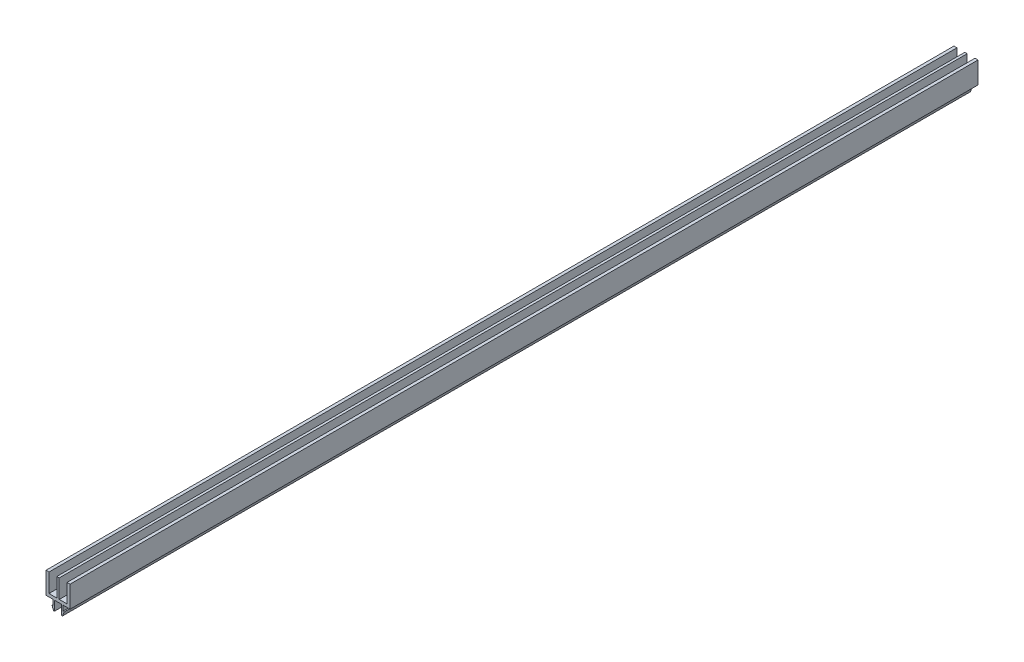
ISO-10303-21;
HEADER;
FILE_DESCRIPTION(('STEP AP214'),'2;1');
FILE_NAME('part.step','',(''),(''),'','','');
FILE_SCHEMA(('AUTOMOTIVE_DESIGN { 1 0 10303 214 1 1 1 1 }'));
ENDSEC;
DATA;
#1=APPLICATION_CONTEXT('core data for automotive mechanical design processes');
#2=APPLICATION_PROTOCOL_DEFINITION('international standard','automotive_design',2000,#1);
#3=PRODUCT_CONTEXT('',#1,'mechanical');
#4=PRODUCT('Part','Part','',(#3));
#5=PRODUCT_RELATED_PRODUCT_CATEGORY('part','',(#4));
#6=PRODUCT_DEFINITION_FORMATION('','',#4);
#7=PRODUCT_DEFINITION_CONTEXT('part definition',#1,'design');
#8=PRODUCT_DEFINITION('design','',#6,#7);
#9=PRODUCT_DEFINITION_SHAPE('','',#8);
#10=(LENGTH_UNIT() NAMED_UNIT(*) SI_UNIT(.MILLI.,.METRE.));
#11=(NAMED_UNIT(*) PLANE_ANGLE_UNIT() SI_UNIT($,.RADIAN.));
#12=(NAMED_UNIT(*) SI_UNIT($,.STERADIAN.) SOLID_ANGLE_UNIT());
#13=UNCERTAINTY_MEASURE_WITH_UNIT(LENGTH_MEASURE(1.E-05),#10,'distance_accuracy_value','');
#14=(GEOMETRIC_REPRESENTATION_CONTEXT(3) GLOBAL_UNCERTAINTY_ASSIGNED_CONTEXT((#13)) GLOBAL_UNIT_ASSIGNED_CONTEXT((#10,
#11,#12)) REPRESENTATION_CONTEXT('',''));
#15=CARTESIAN_POINT('',(0.,0.,0.));
#16=DIRECTION('',(0.,0.,1.));
#17=DIRECTION('',(1.,0.,0.));
#18=AXIS2_PLACEMENT_3D('',#15,#16,#17);
#19=CARTESIAN_POINT('',(-1.,17.9999999975,-704.));
#20=DIRECTION('',(-1.,0.,0.));
#21=DIRECTION('',(0.,-1.,0.));
#22=AXIS2_PLACEMENT_3D('',#19,#20,#21);
#23=PLANE('',#22);
#24=DIRECTION('',(0.,-1.,0.));
#25=VECTOR('',#24,1.);
#26=CARTESIAN_POINT('',(-1.,17.9999999975,50.));
#27=LINE('',#26,#25);
#28=CARTESIAN_POINT('',(-1.,17.9999999975,50.));
#29=VERTEX_POINT('',#28);
#30=CARTESIAN_POINT('',(-1.,2.4999999995,50.));
#31=VERTEX_POINT('',#30);
#32=EDGE_CURVE('E226',#29,#31,#27,.T.);
#33=ORIENTED_EDGE('',*,*,#32,.F.);
#34=DIRECTION('',(0.,0.,1.));
#35=VECTOR('',#34,1.);
#36=CARTESIAN_POINT('',(-1.,17.9999999975,-704.));
#37=LINE('',#36,#35);
#38=CARTESIAN_POINT('',(-1.,17.9999999975,-704.));
#39=VERTEX_POINT('',#38);
#40=EDGE_CURVE('E11',#39,#29,#37,.T.);
#41=ORIENTED_EDGE('',*,*,#40,.F.);
#42=DIRECTION('',(0.,-1.,0.));
#43=VECTOR('',#42,1.);
#44=CARTESIAN_POINT('',(-1.,17.9999999975,-704.));
#45=LINE('',#44,#43);
#46=CARTESIAN_POINT('',(-1.,2.4999999995,-704.));
#47=VERTEX_POINT('',#46);
#48=EDGE_CURVE('E294',#39,#47,#45,.T.);
#49=ORIENTED_EDGE('',*,*,#48,.T.);
#50=DIRECTION('',(0.,0.,1.));
#51=VECTOR('',#50,1.);
#52=CARTESIAN_POINT('',(-1.,2.4999999995,-704.));
#53=LINE('',#52,#51);
#54=EDGE_CURVE('E36',#47,#31,#53,.T.);
#55=ORIENTED_EDGE('',*,*,#54,.T.);
#56=EDGE_LOOP('',(#33,#41,#49,#55));
#57=FACE_BOUND('',#56,.T.);
#58=ADVANCED_FACE('F33',(#57),#23,.T.);
#59=CARTESIAN_POINT('',(0.999999999999998,17.9999999975,-704.));
#60=DIRECTION('',(0.,1.,0.));
#61=DIRECTION('',(0.,0.,1.));
#62=AXIS2_PLACEMENT_3D('',#59,#60,#61);
#63=PLANE('',#62);
#64=DIRECTION('',(-1.,0.,0.));
#65=VECTOR('',#64,1.);
#66=CARTESIAN_POINT('',(0.999999999999998,17.9999999975,50.));
#67=LINE('',#66,#65);
#68=CARTESIAN_POINT('',(0.999999999999998,17.9999999975,50.));
#69=VERTEX_POINT('',#68);
#70=EDGE_CURVE('E292',#69,#29,#67,.T.);
#71=ORIENTED_EDGE('',*,*,#70,.F.);
#72=DIRECTION('',(0.,0.,1.));
#73=VECTOR('',#72,1.);
#74=CARTESIAN_POINT('',(0.999999999999998,17.9999999975,-704.));
#75=LINE('',#74,#73);
#76=CARTESIAN_POINT('',(0.999999999999998,17.9999999975,-704.));
#77=VERTEX_POINT('',#76);
#78=EDGE_CURVE('E42',#77,#69,#75,.T.);
#79=ORIENTED_EDGE('',*,*,#78,.F.);
#80=DIRECTION('',(-1.,0.,0.));
#81=VECTOR('',#80,1.);
#82=CARTESIAN_POINT('',(0.999999999999998,17.9999999975,-704.));
#83=LINE('',#82,#81);
#84=EDGE_CURVE('E216',#77,#39,#83,.T.);
#85=ORIENTED_EDGE('',*,*,#84,.T.);
#86=ORIENTED_EDGE('',*,*,#40,.T.);
#87=EDGE_LOOP('',(#71,#79,#85,#86));
#88=FACE_BOUND('',#87,.T.);
#89=ADVANCED_FACE('F338',(#88),#63,.T.);
#90=CARTESIAN_POINT('',(0.999999999999998,2.4999999995,-704.));
#91=DIRECTION('',(1.,0.,0.));
#92=DIRECTION('',(0.,0.,-1.));
#93=AXIS2_PLACEMENT_3D('',#90,#91,#92);
#94=PLANE('',#93);
#95=DIRECTION('',(0.,1.,0.));
#96=VECTOR('',#95,1.);
#97=CARTESIAN_POINT('',(0.999999999999998,2.4999999995,50.));
#98=LINE('',#97,#96);
#99=CARTESIAN_POINT('',(0.999999999999998,2.4999999995,50.));
#100=VERTEX_POINT('',#99);
#101=EDGE_CURVE('E203',#100,#69,#98,.T.);
#102=ORIENTED_EDGE('',*,*,#101,.F.);
#103=DIRECTION('',(0.,0.,1.));
#104=VECTOR('',#103,1.);
#105=CARTESIAN_POINT('',(0.999999999999998,2.4999999995,-704.));
#106=LINE('',#105,#104);
#107=CARTESIAN_POINT('',(0.999999999999998,2.4999999995,-704.));
#108=VERTEX_POINT('',#107);
#109=EDGE_CURVE('E198',#108,#100,#106,.T.);
#110=ORIENTED_EDGE('',*,*,#109,.F.);
#111=DIRECTION('',(0.,1.,0.));
#112=VECTOR('',#111,1.);
#113=CARTESIAN_POINT('',(0.999999999999998,2.4999999995,-704.));
#114=LINE('',#113,#112);
#115=EDGE_CURVE('E201',#108,#77,#114,.T.);
#116=ORIENTED_EDGE('',*,*,#115,.T.);
#117=ORIENTED_EDGE('',*,*,#78,.T.);
#118=EDGE_LOOP('',(#102,#110,#116,#117));
#119=FACE_BOUND('',#118,.T.);
#120=ADVANCED_FACE('F200',(#119),#94,.T.);
#121=CARTESIAN_POINT('',(7.5,2.4999999995,-704.));
#122=DIRECTION('',(0.,1.,0.));
#123=DIRECTION('',(-1.,0.,0.));
#124=AXIS2_PLACEMENT_3D('',#121,#122,#123);
#125=PLANE('',#124);
#126=DIRECTION('',(-1.,0.,0.));
#127=VECTOR('',#126,1.);
#128=CARTESIAN_POINT('',(7.5,2.4999999995,50.));
#129=LINE('',#128,#127);
#130=CARTESIAN_POINT('',(7.5,2.4999999995,50.));
#131=VERTEX_POINT('',#130);
#132=EDGE_CURVE('E289',#131,#100,#129,.T.);
#133=ORIENTED_EDGE('',*,*,#132,.F.);
#134=DIRECTION('',(0.,0.,1.));
#135=VECTOR('',#134,1.);
#136=CARTESIAN_POINT('',(7.5,2.4999999995,-704.));
#137=LINE('',#136,#135);
#138=CARTESIAN_POINT('',(7.5,2.4999999995,-704.));
#139=VERTEX_POINT('',#138);
#140=EDGE_CURVE('E208',#139,#131,#137,.T.);
#141=ORIENTED_EDGE('',*,*,#140,.F.);
#142=DIRECTION('',(-1.,0.,0.));
#143=VECTOR('',#142,1.);
#144=CARTESIAN_POINT('',(7.5,2.4999999995,-704.));
#145=LINE('',#144,#143);
#146=EDGE_CURVE('E214',#139,#108,#145,.T.);
#147=ORIENTED_EDGE('',*,*,#146,.T.);
#148=ORIENTED_EDGE('',*,*,#109,.T.);
#149=EDGE_LOOP('',(#133,#141,#147,#148));
#150=FACE_BOUND('',#149,.T.);
#151=ADVANCED_FACE('F218',(#150),#125,.T.);
#152=CARTESIAN_POINT('',(7.5,17.9999999975,-704.));
#153=DIRECTION('',(-1.,0.,0.));
#154=DIRECTION('',(0.,-1.,0.));
#155=AXIS2_PLACEMENT_3D('',#152,#153,#154);
#156=PLANE('',#155);
#157=DIRECTION('',(0.,-1.,0.));
#158=VECTOR('',#157,1.);
#159=CARTESIAN_POINT('',(7.5,17.9999999975,50.));
#160=LINE('',#159,#158);
#161=CARTESIAN_POINT('',(7.5,17.9999999975,50.));
#162=VERTEX_POINT('',#161);
#163=EDGE_CURVE('E286',#162,#131,#160,.T.);
#164=ORIENTED_EDGE('',*,*,#163,.F.);
#165=DIRECTION('',(0.,0.,1.));
#166=VECTOR('',#165,1.);
#167=CARTESIAN_POINT('',(7.5,17.9999999975,-704.));
#168=LINE('',#167,#166);
#169=CARTESIAN_POINT('',(7.5,17.9999999975,-704.));
#170=VERTEX_POINT('',#169);
#171=EDGE_CURVE('E298',#170,#162,#168,.T.);
#172=ORIENTED_EDGE('',*,*,#171,.F.);
#173=DIRECTION('',(0.,-1.,0.));
#174=VECTOR('',#173,1.);
#175=CARTESIAN_POINT('',(7.5,17.9999999975,-704.));
#176=LINE('',#175,#174);
#177=EDGE_CURVE('E219',#170,#139,#176,.T.);
#178=ORIENTED_EDGE('',*,*,#177,.T.);
#179=ORIENTED_EDGE('',*,*,#140,.T.);
#180=EDGE_LOOP('',(#164,#172,#178,#179));
#181=FACE_BOUND('',#180,.T.);
#182=ADVANCED_FACE('F351',(#181),#156,.T.);
#183=CARTESIAN_POINT('',(10.,17.9999999975,-704.));
#184=DIRECTION('',(0.,1.,0.));
#185=DIRECTION('',(0.,0.,1.));
#186=AXIS2_PLACEMENT_3D('',#183,#184,#185);
#187=PLANE('',#186);
#188=DIRECTION('',(-1.,0.,0.));
#189=VECTOR('',#188,1.);
#190=CARTESIAN_POINT('',(10.,17.9999999975,50.));
#191=LINE('',#190,#189);
#192=CARTESIAN_POINT('',(10.,17.9999999975,50.));
#193=VERTEX_POINT('',#192);
#194=EDGE_CURVE('E283',#193,#162,#191,.T.);
#195=ORIENTED_EDGE('',*,*,#194,.F.);
#196=DIRECTION('',(0.,0.,1.));
#197=VECTOR('',#196,1.);
#198=CARTESIAN_POINT('',(10.,17.9999999975,-704.));
#199=LINE('',#198,#197);
#200=CARTESIAN_POINT('',(10.,17.9999999975,-704.));
#201=VERTEX_POINT('',#200);
#202=EDGE_CURVE('E300',#201,#193,#199,.T.);
#203=ORIENTED_EDGE('',*,*,#202,.F.);
#204=DIRECTION('',(-1.,0.,0.));
#205=VECTOR('',#204,1.);
#206=CARTESIAN_POINT('',(10.,17.9999999975,-704.));
#207=LINE('',#206,#205);
#208=EDGE_CURVE('E221',#201,#170,#207,.T.);
#209=ORIENTED_EDGE('',*,*,#208,.T.);
#210=ORIENTED_EDGE('',*,*,#171,.T.);
#211=EDGE_LOOP('',(#195,#203,#209,#210));
#212=FACE_BOUND('',#211,.T.);
#213=ADVANCED_FACE('F354',(#212),#187,.T.);
#214=CARTESIAN_POINT('',(10.,-4.99999828349541E-10,-704.));
#215=DIRECTION('',(1.,0.,0.));
#216=DIRECTION('',(0.,0.,-1.));
#217=AXIS2_PLACEMENT_3D('',#214,#215,#216);
#218=PLANE('',#217);
#219=DIRECTION('',(0.,1.,0.));
#220=VECTOR('',#219,1.);
#221=CARTESIAN_POINT('',(10.,-4.99999828349541E-10,50.));
#222=LINE('',#221,#220);
#223=CARTESIAN_POINT('',(10.,-4.99999828349541E-10,50.));
#224=VERTEX_POINT('',#223);
#225=EDGE_CURVE('E280',#224,#193,#222,.T.);
#226=ORIENTED_EDGE('',*,*,#225,.F.);
#227=DIRECTION('',(0.,0.,1.));
#228=VECTOR('',#227,1.);
#229=CARTESIAN_POINT('',(10.,-4.99999828349541E-10,-704.));
#230=LINE('',#229,#228);
#231=CARTESIAN_POINT('',(10.,-4.99999828349541E-10,-704.));
#232=VERTEX_POINT('',#231);
#233=EDGE_CURVE('E302',#232,#224,#230,.T.);
#234=ORIENTED_EDGE('',*,*,#233,.F.);
#235=DIRECTION('',(0.,1.,0.));
#236=VECTOR('',#235,1.);
#237=CARTESIAN_POINT('',(10.,-4.99999828349541E-10,-704.));
#238=LINE('',#237,#236);
#239=EDGE_CURVE('E644',#232,#201,#238,.T.);
#240=ORIENTED_EDGE('',*,*,#239,.T.);
#241=ORIENTED_EDGE('',*,*,#202,.T.);
#242=EDGE_LOOP('',(#226,#234,#240,#241));
#243=FACE_BOUND('',#242,.T.);
#244=ADVANCED_FACE('F358',(#243),#218,.T.);
#245=CARTESIAN_POINT('',(4.,-4.99999998002099E-10,-704.));
#246=DIRECTION('',(0.,-1.,0.));
#247=DIRECTION('',(1.,0.,0.));
#248=AXIS2_PLACEMENT_3D('',#245,#246,#247);
#249=PLANE('',#248);
#250=DIRECTION('',(1.,0.,0.));
#251=VECTOR('',#250,1.);
#252=CARTESIAN_POINT('',(4.,-4.99999998002099E-10,50.));
#253=LINE('',#252,#251);
#254=CARTESIAN_POINT('',(4.,-4.99999998002099E-10,50.));
#255=VERTEX_POINT('',#254);
#256=EDGE_CURVE('E277',#255,#224,#253,.T.);
#257=ORIENTED_EDGE('',*,*,#256,.F.);
#258=DIRECTION('',(0.,0.,1.));
#259=VECTOR('',#258,1.);
#260=CARTESIAN_POINT('',(4.,-4.99999998002099E-10,-704.));
#261=LINE('',#260,#259);
#262=CARTESIAN_POINT('',(4.,-4.99999998002099E-10,-704.));
#263=VERTEX_POINT('',#262);
#264=EDGE_CURVE('E304',#263,#255,#261,.T.);
#265=ORIENTED_EDGE('',*,*,#264,.F.);
#266=DIRECTION('',(1.,0.,0.));
#267=VECTOR('',#266,1.);
#268=CARTESIAN_POINT('',(4.,-4.99999998002099E-10,-704.));
#269=LINE('',#268,#267);
#270=EDGE_CURVE('E648',#263,#232,#269,.T.);
#271=ORIENTED_EDGE('',*,*,#270,.T.);
#272=ORIENTED_EDGE('',*,*,#233,.T.);
#273=EDGE_LOOP('',(#257,#265,#271,#272));
#274=FACE_BOUND('',#273,.T.);
#275=ADVANCED_FACE('F362',(#274),#249,.T.);
#276=CARTESIAN_POINT('',(4.,-4.5,-704.));
#277=DIRECTION('',(1.,0.,0.));
#278=DIRECTION('',(0.,0.,-1.));
#279=AXIS2_PLACEMENT_3D('',#276,#277,#278);
#280=PLANE('',#279);
#281=DIRECTION('',(0.,1.,0.));
#282=VECTOR('',#281,1.);
#283=CARTESIAN_POINT('',(4.,-4.5,50.));
#284=LINE('',#283,#282);
#285=CARTESIAN_POINT('',(4.,-4.5,50.));
#286=VERTEX_POINT('',#285);
#287=EDGE_CURVE('E274',#286,#255,#284,.T.);
#288=ORIENTED_EDGE('',*,*,#287,.F.);
#289=DIRECTION('',(0.,0.,1.));
#290=VECTOR('',#289,1.);
#291=CARTESIAN_POINT('',(4.,-4.5,-704.));
#292=LINE('',#291,#290);
#293=CARTESIAN_POINT('',(4.,-4.5,-704.));
#294=VERTEX_POINT('',#293);
#295=EDGE_CURVE('E306',#294,#286,#292,.T.);
#296=ORIENTED_EDGE('',*,*,#295,.F.);
#297=DIRECTION('',(0.,1.,0.));
#298=VECTOR('',#297,1.);
#299=CARTESIAN_POINT('',(4.,-4.5,-704.));
#300=LINE('',#299,#298);
#301=EDGE_CURVE('E637',#294,#263,#300,.T.);
#302=ORIENTED_EDGE('',*,*,#301,.T.);
#303=ORIENTED_EDGE('',*,*,#264,.T.);
#304=EDGE_LOOP('',(#288,#296,#302,#303));
#305=FACE_BOUND('',#304,.T.);
#306=ADVANCED_FACE('F366',(#305),#280,.T.);
#307=CARTESIAN_POINT('',(5.,-4.5,-704.));
#308=DIRECTION('',(0.,1.,0.));
#309=DIRECTION('',(0.,0.,1.));
#310=AXIS2_PLACEMENT_3D('',#307,#308,#309);
#311=PLANE('',#310);
#312=DIRECTION('',(-1.,0.,0.));
#313=VECTOR('',#312,1.);
#314=CARTESIAN_POINT('',(5.,-4.5,50.));
#315=LINE('',#314,#313);
#316=CARTESIAN_POINT('',(5.,-4.5,50.));
#317=VERTEX_POINT('',#316);
#318=EDGE_CURVE('E271',#317,#286,#315,.T.);
#319=ORIENTED_EDGE('',*,*,#318,.F.);
#320=DIRECTION('',(0.,0.,1.));
#321=VECTOR('',#320,1.);
#322=CARTESIAN_POINT('',(5.,-4.5,-704.));
#323=LINE('',#322,#321);
#324=CARTESIAN_POINT('',(5.,-4.5,-704.));
#325=VERTEX_POINT('',#324);
#326=EDGE_CURVE('E308',#325,#317,#323,.T.);
#327=ORIENTED_EDGE('',*,*,#326,.F.);
#328=DIRECTION('',(-1.,0.,0.));
#329=VECTOR('',#328,1.);
#330=CARTESIAN_POINT('',(5.,-4.5,-704.));
#331=LINE('',#330,#329);
#332=EDGE_CURVE('E633',#325,#294,#331,.T.);
#333=ORIENTED_EDGE('',*,*,#332,.T.);
#334=ORIENTED_EDGE('',*,*,#295,.T.);
#335=EDGE_LOOP('',(#319,#327,#333,#334));
#336=FACE_BOUND('',#335,.T.);
#337=ADVANCED_FACE('F370',(#336),#311,.T.);
#338=CARTESIAN_POINT('',(3.75,-8.,-704.));
#339=DIRECTION('',(0.941741911594837,-0.336336396998157,0.));
#340=DIRECTION('',(0.336336396998157,0.941741911594837,0.));
#341=AXIS2_PLACEMENT_3D('',#338,#339,#340);
#342=PLANE('',#341);
#343=DIRECTION('',(0.336336396998157,0.941741911594837,0.));
#344=VECTOR('',#343,1.);
#345=CARTESIAN_POINT('',(3.75,-8.,50.));
#346=LINE('',#345,#344);
#347=CARTESIAN_POINT('',(3.75,-8.,50.));
#348=VERTEX_POINT('',#347);
#349=EDGE_CURVE('E268',#348,#317,#346,.T.);
#350=ORIENTED_EDGE('',*,*,#349,.F.);
#351=DIRECTION('',(0.,0.,1.));
#352=VECTOR('',#351,1.);
#353=CARTESIAN_POINT('',(3.75,-8.,-704.));
#354=LINE('',#353,#352);
#355=CARTESIAN_POINT('',(3.75,-8.,-704.));
#356=VERTEX_POINT('',#355);
#357=EDGE_CURVE('E310',#356,#348,#354,.T.);
#358=ORIENTED_EDGE('',*,*,#357,.F.);
#359=DIRECTION('',(0.336336396998157,0.941741911594837,0.));
#360=VECTOR('',#359,1.);
#361=CARTESIAN_POINT('',(3.75,-8.,-704.));
#362=LINE('',#361,#360);
#363=EDGE_CURVE('E654',#356,#325,#362,.T.);
#364=ORIENTED_EDGE('',*,*,#363,.T.);
#365=ORIENTED_EDGE('',*,*,#326,.T.);
#366=EDGE_LOOP('',(#350,#358,#364,#365));
#367=FACE_BOUND('',#366,.T.);
#368=ADVANCED_FACE('F374',(#367),#342,.T.);
#369=CARTESIAN_POINT('',(3.,-8.,-704.));
#370=DIRECTION('',(0.,-1.,0.));
#371=DIRECTION('',(0.,0.,-1.));
#372=AXIS2_PLACEMENT_3D('',#369,#370,#371);
#373=PLANE('',#372);
#374=DIRECTION('',(1.,0.,0.));
#375=VECTOR('',#374,1.);
#376=CARTESIAN_POINT('',(3.,-8.,50.));
#377=LINE('',#376,#375);
#378=CARTESIAN_POINT('',(3.,-8.,50.));
#379=VERTEX_POINT('',#378);
#380=EDGE_CURVE('E265',#379,#348,#377,.T.);
#381=ORIENTED_EDGE('',*,*,#380,.F.);
#382=DIRECTION('',(0.,0.,1.));
#383=VECTOR('',#382,1.);
#384=CARTESIAN_POINT('',(3.,-8.,-704.));
#385=LINE('',#384,#383);
#386=CARTESIAN_POINT('',(3.,-8.,-704.));
#387=VERTEX_POINT('',#386);
#388=EDGE_CURVE('E312',#387,#379,#385,.T.);
#389=ORIENTED_EDGE('',*,*,#388,.F.);
#390=DIRECTION('',(1.,0.,0.));
#391=VECTOR('',#390,1.);
#392=CARTESIAN_POINT('',(3.,-8.,-704.));
#393=LINE('',#392,#391);
#394=EDGE_CURVE('E626',#387,#356,#393,.T.);
#395=ORIENTED_EDGE('',*,*,#394,.T.);
#396=ORIENTED_EDGE('',*,*,#357,.T.);
#397=EDGE_LOOP('',(#381,#389,#395,#396));
#398=FACE_BOUND('',#397,.T.);
#399=ADVANCED_FACE('F378',(#398),#373,.T.);
#400=CARTESIAN_POINT('',(3.,-4.9999985194348E-10,-704.));
#401=DIRECTION('',(-1.,0.,0.));
#402=DIRECTION('',(0.,0.,1.));
#403=AXIS2_PLACEMENT_3D('',#400,#401,#402);
#404=PLANE('',#403);
#405=DIRECTION('',(0.,-1.,0.));
#406=VECTOR('',#405,1.);
#407=CARTESIAN_POINT('',(3.,-4.9999985194348E-10,50.));
#408=LINE('',#407,#406);
#409=CARTESIAN_POINT('',(3.,-4.9999985194348E-10,50.));
#410=VERTEX_POINT('',#409);
#411=EDGE_CURVE('E262',#410,#379,#408,.T.);
#412=ORIENTED_EDGE('',*,*,#411,.F.);
#413=DIRECTION('',(0.,0.,1.));
#414=VECTOR('',#413,1.);
#415=CARTESIAN_POINT('',(3.,-4.9999985194348E-10,-704.));
#416=LINE('',#415,#414);
#417=CARTESIAN_POINT('',(3.,-4.9999985194348E-10,-704.));
#418=VERTEX_POINT('',#417);
#419=EDGE_CURVE('E314',#418,#410,#416,.T.);
#420=ORIENTED_EDGE('',*,*,#419,.F.);
#421=DIRECTION('',(0.,-1.,0.));
#422=VECTOR('',#421,1.);
#423=CARTESIAN_POINT('',(3.,-4.9999985194348E-10,-704.));
#424=LINE('',#423,#422);
#425=EDGE_CURVE('E622',#418,#387,#424,.T.);
#426=ORIENTED_EDGE('',*,*,#425,.T.);
#427=ORIENTED_EDGE('',*,*,#388,.T.);
#428=EDGE_LOOP('',(#412,#420,#426,#427));
#429=FACE_BOUND('',#428,.T.);
#430=ADVANCED_FACE('F382',(#429),#404,.T.);
#431=CARTESIAN_POINT('',(-3.,-4.99999455901012E-10,-704.));
#432=DIRECTION('',(0.,-1.,0.));
#433=DIRECTION('',(1.,0.,0.));
#434=AXIS2_PLACEMENT_3D('',#431,#432,#433);
#435=PLANE('',#434);
#436=DIRECTION('',(1.,0.,0.));
#437=VECTOR('',#436,1.);
#438=CARTESIAN_POINT('',(-3.,-4.99999455901012E-10,50.));
#439=LINE('',#438,#437);
#440=CARTESIAN_POINT('',(-3.,-4.99999455901012E-10,50.));
#441=VERTEX_POINT('',#440);
#442=EDGE_CURVE('E259',#441,#410,#439,.T.);
#443=ORIENTED_EDGE('',*,*,#442,.F.);
#444=DIRECTION('',(0.,0.,1.));
#445=VECTOR('',#444,1.);
#446=CARTESIAN_POINT('',(-3.,-4.99999455901012E-10,-704.));
#447=LINE('',#446,#445);
#448=CARTESIAN_POINT('',(-3.,-4.99999455901012E-10,-704.));
#449=VERTEX_POINT('',#448);
#450=EDGE_CURVE('E316',#449,#441,#447,.T.);
#451=ORIENTED_EDGE('',*,*,#450,.F.);
#452=DIRECTION('',(1.,0.,0.));
#453=VECTOR('',#452,1.);
#454=CARTESIAN_POINT('',(-3.,-4.99999455901012E-10,-704.));
#455=LINE('',#454,#453);
#456=EDGE_CURVE('E658',#449,#418,#455,.T.);
#457=ORIENTED_EDGE('',*,*,#456,.T.);
#458=ORIENTED_EDGE('',*,*,#419,.T.);
#459=EDGE_LOOP('',(#443,#451,#457,#458));
#460=FACE_BOUND('',#459,.T.);
#461=ADVANCED_FACE('F386',(#460),#435,.T.);
#462=CARTESIAN_POINT('',(-3.,-8.,-704.));
#463=DIRECTION('',(1.,0.,0.));
#464=DIRECTION('',(0.,0.,-1.));
#465=AXIS2_PLACEMENT_3D('',#462,#463,#464);
#466=PLANE('',#465);
#467=DIRECTION('',(0.,1.,0.));
#468=VECTOR('',#467,1.);
#469=CARTESIAN_POINT('',(-3.,-8.,50.));
#470=LINE('',#469,#468);
#471=CARTESIAN_POINT('',(-3.,-8.,50.));
#472=VERTEX_POINT('',#471);
#473=EDGE_CURVE('E256',#472,#441,#470,.T.);
#474=ORIENTED_EDGE('',*,*,#473,.F.);
#475=DIRECTION('',(0.,0.,1.));
#476=VECTOR('',#475,1.);
#477=CARTESIAN_POINT('',(-3.,-8.,-704.));
#478=LINE('',#477,#476);
#479=CARTESIAN_POINT('',(-3.,-8.,-704.));
#480=VERTEX_POINT('',#479);
#481=EDGE_CURVE('E318',#480,#472,#478,.T.);
#482=ORIENTED_EDGE('',*,*,#481,.F.);
#483=DIRECTION('',(0.,1.,0.));
#484=VECTOR('',#483,1.);
#485=CARTESIAN_POINT('',(-3.,-8.,-704.));
#486=LINE('',#485,#484);
#487=EDGE_CURVE('E615',#480,#449,#486,.T.);
#488=ORIENTED_EDGE('',*,*,#487,.T.);
#489=ORIENTED_EDGE('',*,*,#450,.T.);
#490=EDGE_LOOP('',(#474,#482,#488,#489));
#491=FACE_BOUND('',#490,.T.);
#492=ADVANCED_FACE('F390',(#491),#466,.T.);
#493=CARTESIAN_POINT('',(-3.75,-8.,-704.));
#494=DIRECTION('',(0.,-1.,0.));
#495=DIRECTION('',(0.,0.,-1.));
#496=AXIS2_PLACEMENT_3D('',#493,#494,#495);
#497=PLANE('',#496);
#498=DIRECTION('',(1.,0.,0.));
#499=VECTOR('',#498,1.);
#500=CARTESIAN_POINT('',(-3.75,-8.,50.));
#501=LINE('',#500,#499);
#502=CARTESIAN_POINT('',(-3.75,-8.,50.));
#503=VERTEX_POINT('',#502);
#504=EDGE_CURVE('E253',#503,#472,#501,.T.);
#505=ORIENTED_EDGE('',*,*,#504,.F.);
#506=DIRECTION('',(0.,0.,1.));
#507=VECTOR('',#506,1.);
#508=CARTESIAN_POINT('',(-3.75,-8.,-704.));
#509=LINE('',#508,#507);
#510=CARTESIAN_POINT('',(-3.75,-8.,-704.));
#511=VERTEX_POINT('',#510);
#512=EDGE_CURVE('E320',#511,#503,#509,.T.);
#513=ORIENTED_EDGE('',*,*,#512,.F.);
#514=DIRECTION('',(1.,0.,0.));
#515=VECTOR('',#514,1.);
#516=CARTESIAN_POINT('',(-3.75,-8.,-704.));
#517=LINE('',#516,#515);
#518=EDGE_CURVE('E611',#511,#480,#517,.T.);
#519=ORIENTED_EDGE('',*,*,#518,.T.);
#520=ORIENTED_EDGE('',*,*,#481,.T.);
#521=EDGE_LOOP('',(#505,#513,#519,#520));
#522=FACE_BOUND('',#521,.T.);
#523=ADVANCED_FACE('F394',(#522),#497,.T.);
#524=CARTESIAN_POINT('',(-5.,-4.5,-704.));
#525=DIRECTION('',(-0.941741911594837,-0.336336396998156,0.));
#526=DIRECTION('',(0.336336396998156,-0.941741911594837,0.));
#527=AXIS2_PLACEMENT_3D('',#524,#525,#526);
#528=PLANE('',#527);
#529=DIRECTION('',(0.336336396998156,-0.941741911594837,0.));
#530=VECTOR('',#529,1.);
#531=CARTESIAN_POINT('',(-5.,-4.5,50.));
#532=LINE('',#531,#530);
#533=CARTESIAN_POINT('',(-5.,-4.5,50.));
#534=VERTEX_POINT('',#533);
#535=EDGE_CURVE('E250',#534,#503,#532,.T.);
#536=ORIENTED_EDGE('',*,*,#535,.F.);
#537=DIRECTION('',(0.,0.,1.));
#538=VECTOR('',#537,1.);
#539=CARTESIAN_POINT('',(-5.,-4.5,-704.));
#540=LINE('',#539,#538);
#541=CARTESIAN_POINT('',(-5.,-4.5,-704.));
#542=VERTEX_POINT('',#541);
#543=EDGE_CURVE('E322',#542,#534,#540,.T.);
#544=ORIENTED_EDGE('',*,*,#543,.F.);
#545=DIRECTION('',(0.336336396998156,-0.941741911594837,0.));
#546=VECTOR('',#545,1.);
#547=CARTESIAN_POINT('',(-5.,-4.5,-704.));
#548=LINE('',#547,#546);
#549=EDGE_CURVE('E662',#542,#511,#548,.T.);
#550=ORIENTED_EDGE('',*,*,#549,.T.);
#551=ORIENTED_EDGE('',*,*,#512,.T.);
#552=EDGE_LOOP('',(#536,#544,#550,#551));
#553=FACE_BOUND('',#552,.T.);
#554=ADVANCED_FACE('F398',(#553),#528,.T.);
#555=CARTESIAN_POINT('',(-4.,-4.5,-704.));
#556=DIRECTION('',(0.,1.,0.));
#557=DIRECTION('',(0.,0.,1.));
#558=AXIS2_PLACEMENT_3D('',#555,#556,#557);
#559=PLANE('',#558);
#560=DIRECTION('',(-1.,0.,0.));
#561=VECTOR('',#560,1.);
#562=CARTESIAN_POINT('',(-4.,-4.5,50.));
#563=LINE('',#562,#561);
#564=CARTESIAN_POINT('',(-4.,-4.5,50.));
#565=VERTEX_POINT('',#564);
#566=EDGE_CURVE('E247',#565,#534,#563,.T.);
#567=ORIENTED_EDGE('',*,*,#566,.F.);
#568=DIRECTION('',(0.,0.,1.));
#569=VECTOR('',#568,1.);
#570=CARTESIAN_POINT('',(-4.,-4.5,-704.));
#571=LINE('',#570,#569);
#572=CARTESIAN_POINT('',(-4.,-4.5,-704.));
#573=VERTEX_POINT('',#572);
#574=EDGE_CURVE('E324',#573,#565,#571,.T.);
#575=ORIENTED_EDGE('',*,*,#574,.F.);
#576=DIRECTION('',(-1.,0.,0.));
#577=VECTOR('',#576,1.);
#578=CARTESIAN_POINT('',(-4.,-4.5,-704.));
#579=LINE('',#578,#577);
#580=EDGE_CURVE('E604',#573,#542,#579,.T.);
#581=ORIENTED_EDGE('',*,*,#580,.T.);
#582=ORIENTED_EDGE('',*,*,#543,.T.);
#583=EDGE_LOOP('',(#567,#575,#581,#582));
#584=FACE_BOUND('',#583,.T.);
#585=ADVANCED_FACE('F402',(#584),#559,.T.);
#586=CARTESIAN_POINT('',(-4.,-4.9999985194348E-10,-704.));
#587=DIRECTION('',(-1.,0.,0.));
#588=DIRECTION('',(0.,0.,1.));
#589=AXIS2_PLACEMENT_3D('',#586,#587,#588);
#590=PLANE('',#589);
#591=DIRECTION('',(0.,-1.,0.));
#592=VECTOR('',#591,1.);
#593=CARTESIAN_POINT('',(-4.,-4.9999985194348E-10,50.));
#594=LINE('',#593,#592);
#595=CARTESIAN_POINT('',(-4.,-4.9999985194348E-10,50.));
#596=VERTEX_POINT('',#595);
#597=EDGE_CURVE('E244',#596,#565,#594,.T.);
#598=ORIENTED_EDGE('',*,*,#597,.F.);
#599=DIRECTION('',(0.,0.,1.));
#600=VECTOR('',#599,1.);
#601=CARTESIAN_POINT('',(-4.,-4.9999985194348E-10,-704.));
#602=LINE('',#601,#600);
#603=CARTESIAN_POINT('',(-4.,-4.9999985194348E-10,-704.));
#604=VERTEX_POINT('',#603);
#605=EDGE_CURVE('E326',#604,#596,#602,.T.);
#606=ORIENTED_EDGE('',*,*,#605,.F.);
#607=DIRECTION('',(0.,-1.,0.));
#608=VECTOR('',#607,1.);
#609=CARTESIAN_POINT('',(-4.,-4.9999985194348E-10,-704.));
#610=LINE('',#609,#608);
#611=EDGE_CURVE('E600',#604,#573,#610,.T.);
#612=ORIENTED_EDGE('',*,*,#611,.T.);
#613=ORIENTED_EDGE('',*,*,#574,.T.);
#614=EDGE_LOOP('',(#598,#606,#612,#613));
#615=FACE_BOUND('',#614,.T.);
#616=ADVANCED_FACE('F406',(#615),#590,.T.);
#617=CARTESIAN_POINT('',(-10.,-4.99999719929324E-10,-704.));
#618=DIRECTION('',(0.,-1.,0.));
#619=DIRECTION('',(1.,0.,0.));
#620=AXIS2_PLACEMENT_3D('',#617,#618,#619);
#621=PLANE('',#620);
#622=DIRECTION('',(1.,0.,0.));
#623=VECTOR('',#622,1.);
#624=CARTESIAN_POINT('',(-10.,-4.99999719929324E-10,50.));
#625=LINE('',#624,#623);
#626=CARTESIAN_POINT('',(-10.,-4.99999719929324E-10,50.));
#627=VERTEX_POINT('',#626);
#628=EDGE_CURVE('E241',#627,#596,#625,.T.);
#629=ORIENTED_EDGE('',*,*,#628,.F.);
#630=DIRECTION('',(0.,0.,1.));
#631=VECTOR('',#630,1.);
#632=CARTESIAN_POINT('',(-10.,-4.99999719929324E-10,-704.));
#633=LINE('',#632,#631);
#634=CARTESIAN_POINT('',(-10.,-4.99999719929324E-10,-704.));
#635=VERTEX_POINT('',#634);
#636=EDGE_CURVE('E328',#635,#627,#633,.T.);
#637=ORIENTED_EDGE('',*,*,#636,.F.);
#638=DIRECTION('',(1.,0.,0.));
#639=VECTOR('',#638,1.);
#640=CARTESIAN_POINT('',(-10.,-4.99999719929324E-10,-704.));
#641=LINE('',#640,#639);
#642=EDGE_CURVE('E666',#635,#604,#641,.T.);
#643=ORIENTED_EDGE('',*,*,#642,.T.);
#644=ORIENTED_EDGE('',*,*,#605,.T.);
#645=EDGE_LOOP('',(#629,#637,#643,#644));
#646=FACE_BOUND('',#645,.T.);
#647=ADVANCED_FACE('F410',(#646),#621,.T.);
#648=CARTESIAN_POINT('',(-10.,17.9999999975,-704.));
#649=DIRECTION('',(-1.,0.,0.));
#650=DIRECTION('',(0.,-1.,0.));
#651=AXIS2_PLACEMENT_3D('',#648,#649,#650);
#652=PLANE('',#651);
#653=DIRECTION('',(0.,-1.,0.));
#654=VECTOR('',#653,1.);
#655=CARTESIAN_POINT('',(-10.,17.9999999975,50.));
#656=LINE('',#655,#654);
#657=CARTESIAN_POINT('',(-10.,17.9999999975,50.));
#658=VERTEX_POINT('',#657);
#659=EDGE_CURVE('E238',#658,#627,#656,.T.);
#660=ORIENTED_EDGE('',*,*,#659,.F.);
#661=DIRECTION('',(0.,0.,1.));
#662=VECTOR('',#661,1.);
#663=CARTESIAN_POINT('',(-10.,17.9999999975,-704.));
#664=LINE('',#663,#662);
#665=CARTESIAN_POINT('',(-10.,17.9999999975,-704.));
#666=VERTEX_POINT('',#665);
#667=EDGE_CURVE('E330',#666,#658,#664,.T.);
#668=ORIENTED_EDGE('',*,*,#667,.F.);
#669=DIRECTION('',(0.,-1.,0.));
#670=VECTOR('',#669,1.);
#671=CARTESIAN_POINT('',(-10.,17.9999999975,-704.));
#672=LINE('',#671,#670);
#673=EDGE_CURVE('E593',#666,#635,#672,.T.);
#674=ORIENTED_EDGE('',*,*,#673,.T.);
#675=ORIENTED_EDGE('',*,*,#636,.T.);
#676=EDGE_LOOP('',(#660,#668,#674,#675));
#677=FACE_BOUND('',#676,.T.);
#678=ADVANCED_FACE('F414',(#677),#652,.T.);
#679=CARTESIAN_POINT('',(-7.5,17.9999999975,-704.));
#680=DIRECTION('',(0.,1.,0.));
#681=DIRECTION('',(0.,0.,1.));
#682=AXIS2_PLACEMENT_3D('',#679,#680,#681);
#683=PLANE('',#682);
#684=DIRECTION('',(-1.,0.,0.));
#685=VECTOR('',#684,1.);
#686=CARTESIAN_POINT('',(-7.5,17.9999999975,50.));
#687=LINE('',#686,#685);
#688=CARTESIAN_POINT('',(-7.5,17.9999999975,50.));
#689=VERTEX_POINT('',#688);
#690=EDGE_CURVE('E235',#689,#658,#687,.T.);
#691=ORIENTED_EDGE('',*,*,#690,.F.);
#692=DIRECTION('',(0.,0.,1.));
#693=VECTOR('',#692,1.);
#694=CARTESIAN_POINT('',(-7.5,17.9999999975,-704.));
#695=LINE('',#694,#693);
#696=CARTESIAN_POINT('',(-7.5,17.9999999975,-704.));
#697=VERTEX_POINT('',#696);
#698=EDGE_CURVE('E332',#697,#689,#695,.T.);
#699=ORIENTED_EDGE('',*,*,#698,.F.);
#700=DIRECTION('',(-1.,0.,0.));
#701=VECTOR('',#700,1.);
#702=CARTESIAN_POINT('',(-7.5,17.9999999975,-704.));
#703=LINE('',#702,#701);
#704=EDGE_CURVE('E589',#697,#666,#703,.T.);
#705=ORIENTED_EDGE('',*,*,#704,.T.);
#706=ORIENTED_EDGE('',*,*,#667,.T.);
#707=EDGE_LOOP('',(#691,#699,#705,#706));
#708=FACE_BOUND('',#707,.T.);
#709=ADVANCED_FACE('F418',(#708),#683,.T.);
#710=CARTESIAN_POINT('',(-7.5,2.4999999995,-704.));
#711=DIRECTION('',(1.,0.,0.));
#712=DIRECTION('',(0.,0.,-1.));
#713=AXIS2_PLACEMENT_3D('',#710,#711,#712);
#714=PLANE('',#713);
#715=DIRECTION('',(0.,1.,0.));
#716=VECTOR('',#715,1.);
#717=CARTESIAN_POINT('',(-7.5,2.4999999995,50.));
#718=LINE('',#717,#716);
#719=CARTESIAN_POINT('',(-7.5,2.4999999995,50.));
#720=VERTEX_POINT('',#719);
#721=EDGE_CURVE('E232',#720,#689,#718,.T.);
#722=ORIENTED_EDGE('',*,*,#721,.F.);
#723=DIRECTION('',(0.,0.,1.));
#724=VECTOR('',#723,1.);
#725=CARTESIAN_POINT('',(-7.5,2.4999999995,-704.));
#726=LINE('',#725,#724);
#727=CARTESIAN_POINT('',(-7.5,2.4999999995,-704.));
#728=VERTEX_POINT('',#727);
#729=EDGE_CURVE('E333',#728,#720,#726,.T.);
#730=ORIENTED_EDGE('',*,*,#729,.F.);
#731=DIRECTION('',(0.,1.,0.));
#732=VECTOR('',#731,1.);
#733=CARTESIAN_POINT('',(-7.5,2.4999999995,-704.));
#734=LINE('',#733,#732);
#735=EDGE_CURVE('E670',#728,#697,#734,.T.);
#736=ORIENTED_EDGE('',*,*,#735,.T.);
#737=ORIENTED_EDGE('',*,*,#698,.T.);
#738=EDGE_LOOP('',(#722,#730,#736,#737));
#739=FACE_BOUND('',#738,.T.);
#740=ADVANCED_FACE('F422',(#739),#714,.T.);
#741=CARTESIAN_POINT('',(-1.,2.4999999995,-704.));
#742=DIRECTION('',(0.,1.,0.));
#743=DIRECTION('',(-1.,0.,0.));
#744=AXIS2_PLACEMENT_3D('',#741,#742,#743);
#745=PLANE('',#744);
#746=DIRECTION('',(-1.,0.,0.));
#747=VECTOR('',#746,1.);
#748=CARTESIAN_POINT('',(-1.,2.4999999995,50.));
#749=LINE('',#748,#747);
#750=EDGE_CURVE('E229',#31,#720,#749,.T.);
#751=ORIENTED_EDGE('',*,*,#750,.F.);
#752=ORIENTED_EDGE('',*,*,#54,.F.);
#753=DIRECTION('',(-1.,0.,0.));
#754=VECTOR('',#753,1.);
#755=CARTESIAN_POINT('',(-1.,2.4999999995,-704.));
#756=LINE('',#755,#754);
#757=EDGE_CURVE('E672',#47,#728,#756,.T.);
#758=ORIENTED_EDGE('',*,*,#757,.T.);
#759=ORIENTED_EDGE('',*,*,#729,.T.);
#760=EDGE_LOOP('',(#751,#752,#758,#759));
#761=FACE_BOUND('',#760,.T.);
#762=ADVANCED_FACE('F335',(#761),#745,.T.);
#763=CARTESIAN_POINT('',(0.,0.,-704.));
#764=DIRECTION('',(0.,0.,-1.));
#765=DIRECTION('',(-1.,0.,0.));
#766=AXIS2_PLACEMENT_3D('',#763,#764,#765);
#767=PLANE('',#766);
#768=ORIENTED_EDGE('',*,*,#48,.F.);
#769=ORIENTED_EDGE('',*,*,#84,.F.);
#770=ORIENTED_EDGE('',*,*,#115,.F.);
#771=ORIENTED_EDGE('',*,*,#146,.F.);
#772=ORIENTED_EDGE('',*,*,#177,.F.);
#773=ORIENTED_EDGE('',*,*,#208,.F.);
#774=ORIENTED_EDGE('',*,*,#239,.F.);
#775=ORIENTED_EDGE('',*,*,#270,.F.);
#776=ORIENTED_EDGE('',*,*,#301,.F.);
#777=ORIENTED_EDGE('',*,*,#332,.F.);
#778=ORIENTED_EDGE('',*,*,#363,.F.);
#779=ORIENTED_EDGE('',*,*,#394,.F.);
#780=ORIENTED_EDGE('',*,*,#425,.F.);
#781=ORIENTED_EDGE('',*,*,#456,.F.);
#782=ORIENTED_EDGE('',*,*,#487,.F.);
#783=ORIENTED_EDGE('',*,*,#518,.F.);
#784=ORIENTED_EDGE('',*,*,#549,.F.);
#785=ORIENTED_EDGE('',*,*,#580,.F.);
#786=ORIENTED_EDGE('',*,*,#611,.F.);
#787=ORIENTED_EDGE('',*,*,#642,.F.);
#788=ORIENTED_EDGE('',*,*,#673,.F.);
#789=ORIENTED_EDGE('',*,*,#704,.F.);
#790=ORIENTED_EDGE('',*,*,#735,.F.);
#791=ORIENTED_EDGE('',*,*,#757,.F.);
#792=EDGE_LOOP('',(#768,#769,#770,#771,#772,#773,#774,#775,#776,#777,#778,#779,#780,#781,#782,
#783,#784,#785,#786,#787,#788,#789,#790,#791));
#793=FACE_BOUND('',#792,.T.);
#794=ADVANCED_FACE('F212',(#793),#767,.T.);
#795=CARTESIAN_POINT('',(0.,0.,50.));
#796=DIRECTION('',(0.,0.,-1.));
#797=DIRECTION('',(-1.,0.,0.));
#798=AXIS2_PLACEMENT_3D('',#795,#796,#797);
#799=PLANE('',#798);
#800=ORIENTED_EDGE('',*,*,#32,.T.);
#801=ORIENTED_EDGE('',*,*,#750,.T.);
#802=ORIENTED_EDGE('',*,*,#721,.T.);
#803=ORIENTED_EDGE('',*,*,#690,.T.);
#804=ORIENTED_EDGE('',*,*,#659,.T.);
#805=ORIENTED_EDGE('',*,*,#628,.T.);
#806=ORIENTED_EDGE('',*,*,#597,.T.);
#807=ORIENTED_EDGE('',*,*,#566,.T.);
#808=ORIENTED_EDGE('',*,*,#535,.T.);
#809=ORIENTED_EDGE('',*,*,#504,.T.);
#810=ORIENTED_EDGE('',*,*,#473,.T.);
#811=ORIENTED_EDGE('',*,*,#442,.T.);
#812=ORIENTED_EDGE('',*,*,#411,.T.);
#813=ORIENTED_EDGE('',*,*,#380,.T.);
#814=ORIENTED_EDGE('',*,*,#349,.T.);
#815=ORIENTED_EDGE('',*,*,#318,.T.);
#816=ORIENTED_EDGE('',*,*,#287,.T.);
#817=ORIENTED_EDGE('',*,*,#256,.T.);
#818=ORIENTED_EDGE('',*,*,#225,.T.);
#819=ORIENTED_EDGE('',*,*,#194,.T.);
#820=ORIENTED_EDGE('',*,*,#163,.T.);
#821=ORIENTED_EDGE('',*,*,#132,.T.);
#822=ORIENTED_EDGE('',*,*,#101,.T.);
#823=ORIENTED_EDGE('',*,*,#70,.T.);
#824=EDGE_LOOP('',(#800,#801,#802,#803,#804,#805,#806,#807,#808,#809,#810,#811,#812,#813,#814,
#815,#816,#817,#818,#819,#820,#821,#822,#823));
#825=FACE_BOUND('',#824,.T.);
#826=ADVANCED_FACE('F337',(#825),#799,.F.);
#827=CLOSED_SHELL('',(#58,#89,#120,#151,#182,#213,#244,#275,#306,#337,#368,#399,#430,#461,#492,
#523,#554,#585,#616,#647,#678,#709,#740,#762,#794,#826));
#828=MANIFOLD_SOLID_BREP('B2',#827);
#829=ADVANCED_BREP_SHAPE_REPRESENTATION('',(#18,#828),#14);
#830=SHAPE_DEFINITION_REPRESENTATION(#9,#829);
ENDSEC;
END-ISO-10303-21;
